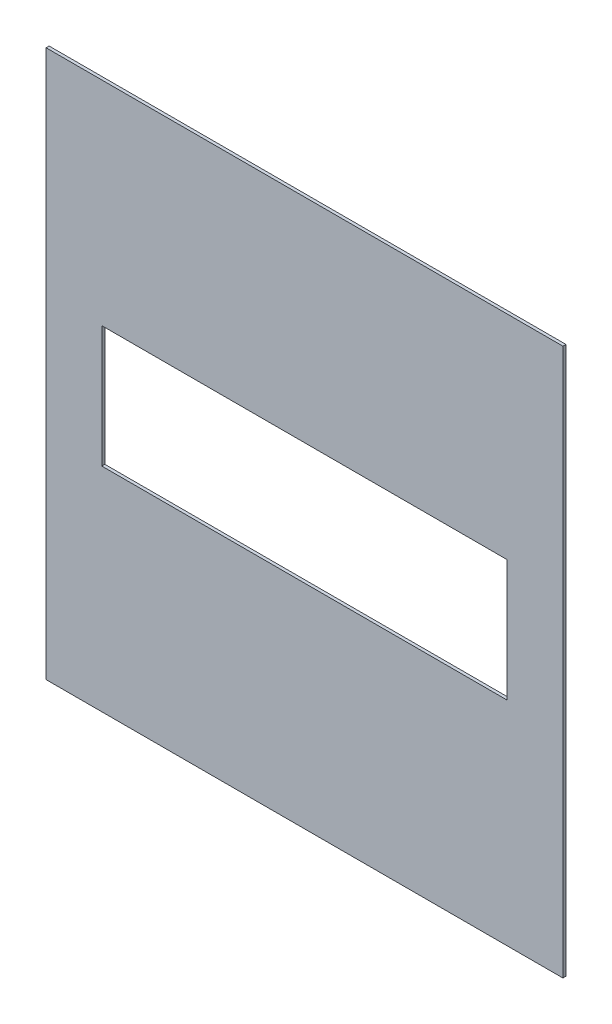
ISO-10303-21;
HEADER;
FILE_DESCRIPTION(('STEP AP214'),'2;1');
FILE_NAME('part.step','',(''),(''),'','','');
FILE_SCHEMA(('AUTOMOTIVE_DESIGN { 1 0 10303 214 1 1 1 1 }'));
ENDSEC;
DATA;
#1=APPLICATION_CONTEXT('core data for automotive mechanical design processes');
#2=APPLICATION_PROTOCOL_DEFINITION('international standard','automotive_design',2000,#1);
#3=PRODUCT_CONTEXT('',#1,'mechanical');
#4=PRODUCT('Part','Part','',(#3));
#5=PRODUCT_RELATED_PRODUCT_CATEGORY('part','',(#4));
#6=PRODUCT_DEFINITION_FORMATION('','',#4);
#7=PRODUCT_DEFINITION_CONTEXT('part definition',#1,'design');
#8=PRODUCT_DEFINITION('design','',#6,#7);
#9=PRODUCT_DEFINITION_SHAPE('','',#8);
#10=(LENGTH_UNIT() NAMED_UNIT(*) SI_UNIT(.MILLI.,.METRE.));
#11=(NAMED_UNIT(*) PLANE_ANGLE_UNIT() SI_UNIT($,.RADIAN.));
#12=(NAMED_UNIT(*) SI_UNIT($,.STERADIAN.) SOLID_ANGLE_UNIT());
#13=UNCERTAINTY_MEASURE_WITH_UNIT(LENGTH_MEASURE(1.E-05),#10,'distance_accuracy_value','');
#14=(GEOMETRIC_REPRESENTATION_CONTEXT(3) GLOBAL_UNCERTAINTY_ASSIGNED_CONTEXT((#13)) GLOBAL_UNIT_ASSIGNED_CONTEXT((#10,
#11,#12)) REPRESENTATION_CONTEXT('',''));
#15=CARTESIAN_POINT('',(0.,0.,0.));
#16=DIRECTION('',(0.,0.,1.));
#17=DIRECTION('',(1.,0.,0.));
#18=AXIS2_PLACEMENT_3D('',#15,#16,#17);
#19=CARTESIAN_POINT('',(-255.,270.,3.));
#20=DIRECTION('',(1.,0.,0.));
#21=DIRECTION('',(0.,1.,0.));
#22=AXIS2_PLACEMENT_3D('',#19,#20,#21);
#23=PLANE('',#22);
#24=DIRECTION('',(0.,-1.,0.));
#25=VECTOR('',#24,1.);
#26=CARTESIAN_POINT('',(-255.,270.,0.));
#27=LINE('',#26,#25);
#28=CARTESIAN_POINT('',(-255.,270.,0.));
#29=VERTEX_POINT('',#28);
#30=CARTESIAN_POINT('',(-255.,-270.,0.));
#31=VERTEX_POINT('',#30);
#32=EDGE_CURVE('E109',#29,#31,#27,.T.);
#33=ORIENTED_EDGE('',*,*,#32,.T.);
#34=DIRECTION('',(0.,0.,-1.));
#35=VECTOR('',#34,1.);
#36=CARTESIAN_POINT('',(-255.,-270.,3.));
#37=LINE('',#36,#35);
#38=CARTESIAN_POINT('',(-255.,-270.,3.));
#39=VERTEX_POINT('',#38);
#40=EDGE_CURVE('E11',#39,#31,#37,.T.);
#41=ORIENTED_EDGE('',*,*,#40,.F.);
#42=DIRECTION('',(0.,-1.,0.));
#43=VECTOR('',#42,1.);
#44=CARTESIAN_POINT('',(-255.,270.,3.));
#45=LINE('',#44,#43);
#46=CARTESIAN_POINT('',(-255.,270.,3.));
#47=VERTEX_POINT('',#46);
#48=EDGE_CURVE('E148',#47,#39,#45,.T.);
#49=ORIENTED_EDGE('',*,*,#48,.F.);
#50=DIRECTION('',(0.,0.,-1.));
#51=VECTOR('',#50,1.);
#52=CARTESIAN_POINT('',(-255.,270.,3.));
#53=LINE('',#52,#51);
#54=EDGE_CURVE('E162',#47,#29,#53,.T.);
#55=ORIENTED_EDGE('',*,*,#54,.T.);
#56=EDGE_LOOP('',(#33,#41,#49,#55));
#57=FACE_BOUND('',#56,.T.);
#58=ADVANCED_FACE('F37',(#57),#23,.F.);
#59=CARTESIAN_POINT('',(255.,-270.,3.));
#60=DIRECTION('',(0.,1.,0.));
#61=DIRECTION('',(-1.,0.,0.));
#62=AXIS2_PLACEMENT_3D('',#59,#60,#61);
#63=PLANE('',#62);
#64=DIRECTION('',(1.,0.,0.));
#65=VECTOR('',#64,1.);
#66=CARTESIAN_POINT('',(255.,-270.,0.));
#67=LINE('',#66,#65);
#68=CARTESIAN_POINT('',(255.,-270.,0.));
#69=VERTEX_POINT('',#68);
#70=EDGE_CURVE('E166',#31,#69,#67,.T.);
#71=ORIENTED_EDGE('',*,*,#70,.T.);
#72=DIRECTION('',(0.,0.,-1.));
#73=VECTOR('',#72,1.);
#74=CARTESIAN_POINT('',(255.,-270.,3.));
#75=LINE('',#74,#73);
#76=CARTESIAN_POINT('',(255.,-270.,3.));
#77=VERTEX_POINT('',#76);
#78=EDGE_CURVE('E45',#77,#69,#75,.T.);
#79=ORIENTED_EDGE('',*,*,#78,.F.);
#80=DIRECTION('',(1.,0.,0.));
#81=VECTOR('',#80,1.);
#82=CARTESIAN_POINT('',(255.,-270.,3.));
#83=LINE('',#82,#81);
#84=EDGE_CURVE('E152',#39,#77,#83,.T.);
#85=ORIENTED_EDGE('',*,*,#84,.F.);
#86=ORIENTED_EDGE('',*,*,#40,.T.);
#87=EDGE_LOOP('',(#71,#79,#85,#86));
#88=FACE_BOUND('',#87,.T.);
#89=ADVANCED_FACE('F200',(#88),#63,.F.);
#90=CARTESIAN_POINT('',(255.,270.,3.));
#91=DIRECTION('',(-1.,0.,0.));
#92=DIRECTION('',(0.,-1.,0.));
#93=AXIS2_PLACEMENT_3D('',#90,#91,#92);
#94=PLANE('',#93);
#95=DIRECTION('',(0.,1.,0.));
#96=VECTOR('',#95,1.);
#97=CARTESIAN_POINT('',(255.,270.,0.));
#98=LINE('',#97,#96);
#99=CARTESIAN_POINT('',(255.,270.,0.));
#100=VERTEX_POINT('',#99);
#101=EDGE_CURVE('E169',#69,#100,#98,.T.);
#102=ORIENTED_EDGE('',*,*,#101,.T.);
#103=DIRECTION('',(0.,0.,-1.));
#104=VECTOR('',#103,1.);
#105=CARTESIAN_POINT('',(255.,270.,3.));
#106=LINE('',#105,#104);
#107=CARTESIAN_POINT('',(255.,270.,3.));
#108=VERTEX_POINT('',#107);
#109=EDGE_CURVE('E177',#108,#100,#106,.T.);
#110=ORIENTED_EDGE('',*,*,#109,.F.);
#111=DIRECTION('',(0.,1.,0.));
#112=VECTOR('',#111,1.);
#113=CARTESIAN_POINT('',(255.,270.,3.));
#114=LINE('',#113,#112);
#115=EDGE_CURVE('E156',#77,#108,#114,.T.);
#116=ORIENTED_EDGE('',*,*,#115,.F.);
#117=ORIENTED_EDGE('',*,*,#78,.T.);
#118=EDGE_LOOP('',(#102,#110,#116,#117));
#119=FACE_BOUND('',#118,.T.);
#120=ADVANCED_FACE('F186',(#119),#94,.F.);
#121=CARTESIAN_POINT('',(255.,270.,3.));
#122=DIRECTION('',(0.,-1.,0.));
#123=DIRECTION('',(1.,0.,0.));
#124=AXIS2_PLACEMENT_3D('',#121,#122,#123);
#125=PLANE('',#124);
#126=DIRECTION('',(-1.,0.,0.));
#127=VECTOR('',#126,1.);
#128=CARTESIAN_POINT('',(255.,270.,0.));
#129=LINE('',#128,#127);
#130=EDGE_CURVE('E153',#100,#29,#129,.T.);
#131=ORIENTED_EDGE('',*,*,#130,.T.);
#132=ORIENTED_EDGE('',*,*,#54,.F.);
#133=DIRECTION('',(-1.,0.,0.));
#134=VECTOR('',#133,1.);
#135=CARTESIAN_POINT('',(255.,270.,3.));
#136=LINE('',#135,#134);
#137=EDGE_CURVE('E159',#108,#47,#136,.T.);
#138=ORIENTED_EDGE('',*,*,#137,.F.);
#139=ORIENTED_EDGE('',*,*,#109,.T.);
#140=EDGE_LOOP('',(#131,#132,#138,#139));
#141=FACE_BOUND('',#140,.T.);
#142=ADVANCED_FACE('F193',(#141),#125,.F.);
#143=CARTESIAN_POINT('',(0.,0.,3.));
#144=DIRECTION('',(0.,0.,-1.));
#145=DIRECTION('',(-1.,0.,0.));
#146=AXIS2_PLACEMENT_3D('',#143,#144,#145);
#147=PLANE('',#146);
#148=DIRECTION('',(1.,0.,0.));
#149=VECTOR('',#148,1.);
#150=CARTESIAN_POINT('',(200.,-60.,3.));
#151=LINE('',#150,#149);
#152=CARTESIAN_POINT('',(-200.,-60.,3.));
#153=VERTEX_POINT('',#152);
#154=CARTESIAN_POINT('',(200.,-60.,3.));
#155=VERTEX_POINT('',#154);
#156=EDGE_CURVE('E126',#153,#155,#151,.T.);
#157=ORIENTED_EDGE('',*,*,#156,.F.);
#158=DIRECTION('',(0.,-1.,0.));
#159=VECTOR('',#158,1.);
#160=CARTESIAN_POINT('',(-200.,-60.,3.));
#161=LINE('',#160,#159);
#162=CARTESIAN_POINT('',(-200.,60.,3.));
#163=VERTEX_POINT('',#162);
#164=EDGE_CURVE('E52',#163,#153,#161,.T.);
#165=ORIENTED_EDGE('',*,*,#164,.F.);
#166=DIRECTION('',(-1.,0.,0.));
#167=VECTOR('',#166,1.);
#168=CARTESIAN_POINT('',(200.,60.,3.));
#169=LINE('',#168,#167);
#170=CARTESIAN_POINT('',(200.,60.,3.));
#171=VERTEX_POINT('',#170);
#172=EDGE_CURVE('E116',#171,#163,#169,.T.);
#173=ORIENTED_EDGE('',*,*,#172,.F.);
#174=DIRECTION('',(0.,1.,0.));
#175=VECTOR('',#174,1.);
#176=CARTESIAN_POINT('',(200.,-60.,3.));
#177=LINE('',#176,#175);
#178=EDGE_CURVE('E134',#155,#171,#177,.T.);
#179=ORIENTED_EDGE('',*,*,#178,.F.);
#180=EDGE_LOOP('',(#157,#165,#173,#179));
#181=FACE_BOUND('',#180,.T.);
#182=ORIENTED_EDGE('',*,*,#48,.T.);
#183=ORIENTED_EDGE('',*,*,#84,.T.);
#184=ORIENTED_EDGE('',*,*,#115,.T.);
#185=ORIENTED_EDGE('',*,*,#137,.T.);
#186=EDGE_LOOP('',(#182,#183,#184,#185));
#187=FACE_BOUND('',#186,.T.);
#188=ADVANCED_FACE('F199',(#181,#187),#147,.F.);
#189=CARTESIAN_POINT('',(0.,0.,0.));
#190=DIRECTION('',(0.,0.,-1.));
#191=DIRECTION('',(-1.,0.,0.));
#192=AXIS2_PLACEMENT_3D('',#189,#190,#191);
#193=PLANE('',#192);
#194=DIRECTION('',(0.,-1.,0.));
#195=VECTOR('',#194,1.);
#196=CARTESIAN_POINT('',(-200.,-60.,0.));
#197=LINE('',#196,#195);
#198=CARTESIAN_POINT('',(-200.,60.,0.));
#199=VERTEX_POINT('',#198);
#200=CARTESIAN_POINT('',(-200.,-60.,0.));
#201=VERTEX_POINT('',#200);
#202=EDGE_CURVE('E113',#199,#201,#197,.T.);
#203=ORIENTED_EDGE('',*,*,#202,.T.);
#204=DIRECTION('',(1.,0.,0.));
#205=VECTOR('',#204,1.);
#206=CARTESIAN_POINT('',(200.,-60.,0.));
#207=LINE('',#206,#205);
#208=CARTESIAN_POINT('',(200.,-60.,0.));
#209=VERTEX_POINT('',#208);
#210=EDGE_CURVE('E101',#201,#209,#207,.T.);
#211=ORIENTED_EDGE('',*,*,#210,.T.);
#212=DIRECTION('',(0.,1.,0.));
#213=VECTOR('',#212,1.);
#214=CARTESIAN_POINT('',(200.,-60.,0.));
#215=LINE('',#214,#213);
#216=CARTESIAN_POINT('',(200.,60.,0.));
#217=VERTEX_POINT('',#216);
#218=EDGE_CURVE('E128',#209,#217,#215,.T.);
#219=ORIENTED_EDGE('',*,*,#218,.T.);
#220=DIRECTION('',(-1.,0.,0.));
#221=VECTOR('',#220,1.);
#222=CARTESIAN_POINT('',(200.,60.,0.));
#223=LINE('',#222,#221);
#224=EDGE_CURVE('E121',#217,#199,#223,.T.);
#225=ORIENTED_EDGE('',*,*,#224,.T.);
#226=EDGE_LOOP('',(#203,#211,#219,#225));
#227=FACE_BOUND('',#226,.T.);
#228=ORIENTED_EDGE('',*,*,#32,.F.);
#229=ORIENTED_EDGE('',*,*,#130,.F.);
#230=ORIENTED_EDGE('',*,*,#101,.F.);
#231=ORIENTED_EDGE('',*,*,#70,.F.);
#232=EDGE_LOOP('',(#228,#229,#230,#231));
#233=FACE_BOUND('',#232,.T.);
#234=ADVANCED_FACE('F119',(#227,#233),#193,.T.);
#235=CARTESIAN_POINT('',(-200.,-60.,-0.00100000000000013));
#236=DIRECTION('',(-1.,0.,0.));
#237=DIRECTION('',(0.,0.,1.));
#238=AXIS2_PLACEMENT_3D('',#235,#236,#237);
#239=PLANE('',#238);
#240=DIRECTION('',(0.,0.,1.));
#241=VECTOR('',#240,1.);
#242=CARTESIAN_POINT('',(-200.,60.,-0.00100000000000013));
#243=LINE('',#242,#241);
#244=EDGE_CURVE('E110',#199,#163,#243,.T.);
#245=ORIENTED_EDGE('',*,*,#244,.T.);
#246=ORIENTED_EDGE('',*,*,#164,.T.);
#247=DIRECTION('',(0.,0.,1.));
#248=VECTOR('',#247,1.);
#249=CARTESIAN_POINT('',(-200.,-60.,-0.00100000000000013));
#250=LINE('',#249,#248);
#251=EDGE_CURVE('E103',#201,#153,#250,.T.);
#252=ORIENTED_EDGE('',*,*,#251,.F.);
#253=ORIENTED_EDGE('',*,*,#202,.F.);
#254=EDGE_LOOP('',(#245,#246,#252,#253));
#255=FACE_BOUND('',#254,.T.);
#256=ADVANCED_FACE('F112',(#255),#239,.F.);
#257=CARTESIAN_POINT('',(200.,60.,-0.00100000000000013));
#258=DIRECTION('',(0.,1.,0.));
#259=DIRECTION('',(-1.,0.,0.));
#260=AXIS2_PLACEMENT_3D('',#257,#258,#259);
#261=PLANE('',#260);
#262=DIRECTION('',(0.,0.,1.));
#263=VECTOR('',#262,1.);
#264=CARTESIAN_POINT('',(200.,60.,-0.00100000000000013));
#265=LINE('',#264,#263);
#266=EDGE_CURVE('E143',#217,#171,#265,.T.);
#267=ORIENTED_EDGE('',*,*,#266,.T.);
#268=ORIENTED_EDGE('',*,*,#172,.T.);
#269=ORIENTED_EDGE('',*,*,#244,.F.);
#270=ORIENTED_EDGE('',*,*,#224,.F.);
#271=EDGE_LOOP('',(#267,#268,#269,#270));
#272=FACE_BOUND('',#271,.T.);
#273=ADVANCED_FACE('F217',(#272),#261,.F.);
#274=CARTESIAN_POINT('',(200.,-60.,-0.00100000000000013));
#275=DIRECTION('',(1.,0.,0.));
#276=DIRECTION('',(0.,0.,-1.));
#277=AXIS2_PLACEMENT_3D('',#274,#275,#276);
#278=PLANE('',#277);
#279=DIRECTION('',(0.,0.,1.));
#280=VECTOR('',#279,1.);
#281=CARTESIAN_POINT('',(200.,-60.,-0.00100000000000013));
#282=LINE('',#281,#280);
#283=EDGE_CURVE('E60',#209,#155,#282,.T.);
#284=ORIENTED_EDGE('',*,*,#283,.T.);
#285=ORIENTED_EDGE('',*,*,#178,.T.);
#286=ORIENTED_EDGE('',*,*,#266,.F.);
#287=ORIENTED_EDGE('',*,*,#218,.F.);
#288=EDGE_LOOP('',(#284,#285,#286,#287));
#289=FACE_BOUND('',#288,.T.);
#290=ADVANCED_FACE('F220',(#289),#278,.F.);
#291=CARTESIAN_POINT('',(200.,-60.,-0.00100000000000013));
#292=DIRECTION('',(0.,-1.,0.));
#293=DIRECTION('',(1.,0.,0.));
#294=AXIS2_PLACEMENT_3D('',#291,#292,#293);
#295=PLANE('',#294);
#296=ORIENTED_EDGE('',*,*,#251,.T.);
#297=ORIENTED_EDGE('',*,*,#156,.T.);
#298=ORIENTED_EDGE('',*,*,#283,.F.);
#299=ORIENTED_EDGE('',*,*,#210,.F.);
#300=EDGE_LOOP('',(#296,#297,#298,#299));
#301=FACE_BOUND('',#300,.T.);
#302=ADVANCED_FACE('F102',(#301),#295,.F.);
#303=CLOSED_SHELL('',(#58,#89,#120,#142,#188,#234,#256,#273,#290,#302));
#304=MANIFOLD_SOLID_BREP('B2',#303);
#305=ADVANCED_BREP_SHAPE_REPRESENTATION('',(#18,#304),#14);
#306=SHAPE_DEFINITION_REPRESENTATION(#9,#305);
ENDSEC;
END-ISO-10303-21;
